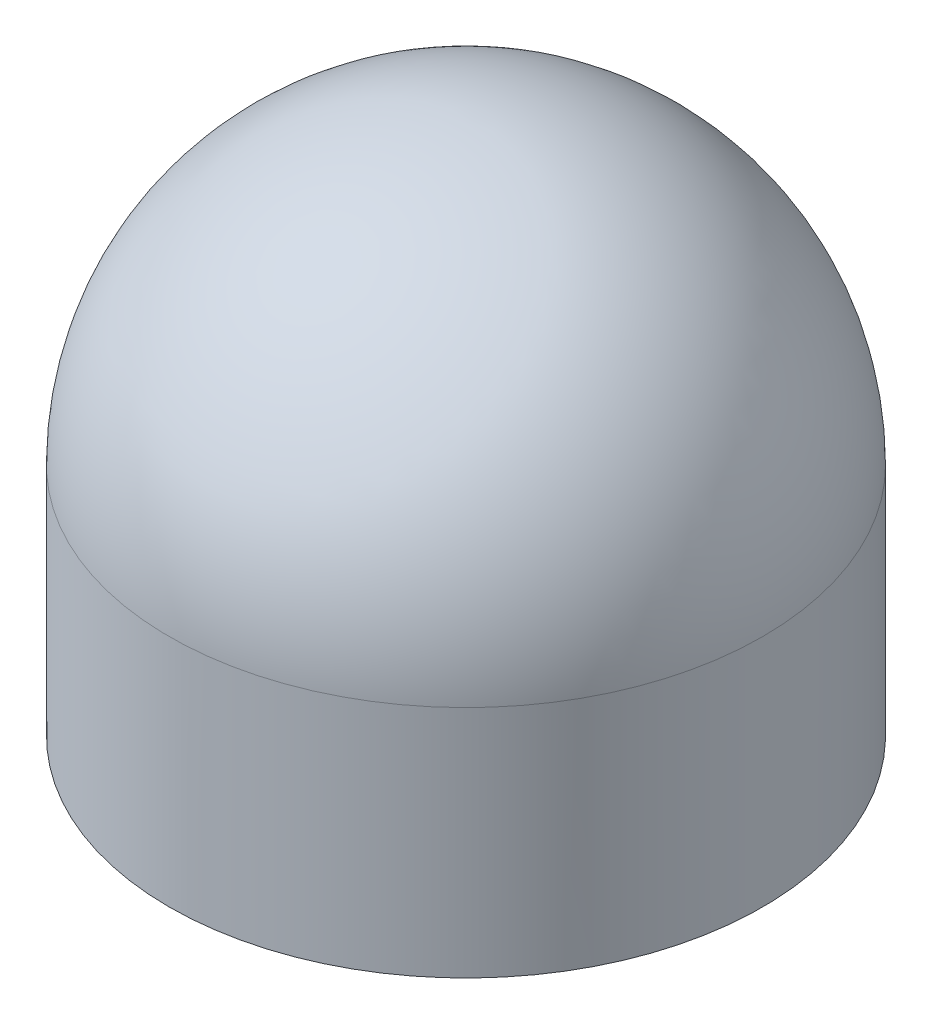
ISO-10303-21;
HEADER;
FILE_DESCRIPTION(('STEP AP214'),'2;1');
FILE_NAME('part.step','',(''),(''),'','','');
FILE_SCHEMA(('AUTOMOTIVE_DESIGN { 1 0 10303 214 1 1 1 1 }'));
ENDSEC;
DATA;
#1=APPLICATION_CONTEXT('core data for automotive mechanical design processes');
#2=APPLICATION_PROTOCOL_DEFINITION('international standard','automotive_design',2000,#1);
#3=PRODUCT_CONTEXT('',#1,'mechanical');
#4=PRODUCT('Part','Part','',(#3));
#5=PRODUCT_RELATED_PRODUCT_CATEGORY('part','',(#4));
#6=PRODUCT_DEFINITION_FORMATION('','',#4);
#7=PRODUCT_DEFINITION_CONTEXT('part definition',#1,'design');
#8=PRODUCT_DEFINITION('design','',#6,#7);
#9=PRODUCT_DEFINITION_SHAPE('','',#8);
#10=(LENGTH_UNIT() NAMED_UNIT(*) SI_UNIT(.MILLI.,.METRE.));
#11=(NAMED_UNIT(*) PLANE_ANGLE_UNIT() SI_UNIT($,.RADIAN.));
#12=(NAMED_UNIT(*) SI_UNIT($,.STERADIAN.) SOLID_ANGLE_UNIT());
#13=UNCERTAINTY_MEASURE_WITH_UNIT(LENGTH_MEASURE(1.E-05),#10,'distance_accuracy_value','');
#14=(GEOMETRIC_REPRESENTATION_CONTEXT(3) GLOBAL_UNCERTAINTY_ASSIGNED_CONTEXT((#13)) GLOBAL_UNIT_ASSIGNED_CONTEXT((#10,
#11,#12)) REPRESENTATION_CONTEXT('',''));
#15=CARTESIAN_POINT('',(0.,0.,0.));
#16=DIRECTION('',(0.,0.,1.));
#17=DIRECTION('',(1.,0.,0.));
#18=AXIS2_PLACEMENT_3D('',#15,#16,#17);
#19=CARTESIAN_POINT('',(0.,0.,0.));
#20=DIRECTION('',(0.,-1.,0.));
#21=DIRECTION('',(0.,0.,-1.));
#22=AXIS2_PLACEMENT_3D('',#19,#20,#21);
#23=PLANE('',#22);
#24=CARTESIAN_POINT('',(0.,0.,0.));
#25=DIRECTION('',(0.,-1.,0.));
#26=DIRECTION('',(0.,0.,-1.));
#27=AXIS2_PLACEMENT_3D('',#24,#25,#26);
#28=CIRCLE('',#27,9.652);
#29=CARTESIAN_POINT('',(0.,0.,-9.652));
#30=VERTEX_POINT('',#29);
#31=EDGE_CURVE('E10',#30,#30,#28,.T.);
#32=ORIENTED_EDGE('',*,*,#31,.T.);
#33=EDGE_LOOP('',(#32));
#34=FACE_BOUND('',#33,.T.);
#35=ADVANCED_FACE('F31',(#34),#23,.T.);
#36=CARTESIAN_POINT('',(0.,7.62,0.));
#37=DIRECTION('',(0.,-1.,0.));
#38=DIRECTION('',(0.,0.,-1.));
#39=AXIS2_PLACEMENT_3D('',#36,#37,#38);
#40=CYLINDRICAL_SURFACE('',#39,9.652);
#41=CARTESIAN_POINT('',(0.,7.62,0.));
#42=DIRECTION('',(0.,-1.,0.));
#43=DIRECTION('',(0.,0.,-1.));
#44=AXIS2_PLACEMENT_3D('',#41,#42,#43);
#45=CIRCLE('',#44,9.652);
#46=CARTESIAN_POINT('',(0.,7.62,-9.652));
#47=VERTEX_POINT('',#46);
#48=EDGE_CURVE('E37',#47,#47,#45,.T.);
#49=ORIENTED_EDGE('',*,*,#48,.T.);
#50=EDGE_LOOP('',(#49));
#51=FACE_BOUND('',#50,.T.);
#52=ORIENTED_EDGE('',*,*,#31,.F.);
#53=EDGE_LOOP('',(#52));
#54=FACE_BOUND('',#53,.T.);
#55=ADVANCED_FACE('F43',(#51,#54),#40,.T.);
#56=CARTESIAN_POINT('',(0.,7.62,0.));
#57=DIRECTION('',(0.,-1.,0.));
#58=DIRECTION('',(1.,0.,0.));
#59=AXIS2_PLACEMENT_3D('',#56,#57,#58);
#60=SPHERICAL_SURFACE('',#59,9.652);
#61=ORIENTED_EDGE('',*,*,#48,.F.);
#62=EDGE_LOOP('',(#61));
#63=FACE_BOUND('',#62,.T.);
#64=ADVANCED_FACE('F46',(#63),#60,.T.);
#65=CLOSED_SHELL('',(#35,#55,#64));
#66=MANIFOLD_SOLID_BREP('B2',#65);
#67=ADVANCED_BREP_SHAPE_REPRESENTATION('',(#18,#66),#14);
#68=SHAPE_DEFINITION_REPRESENTATION(#9,#67);
ENDSEC;
END-ISO-10303-21;
